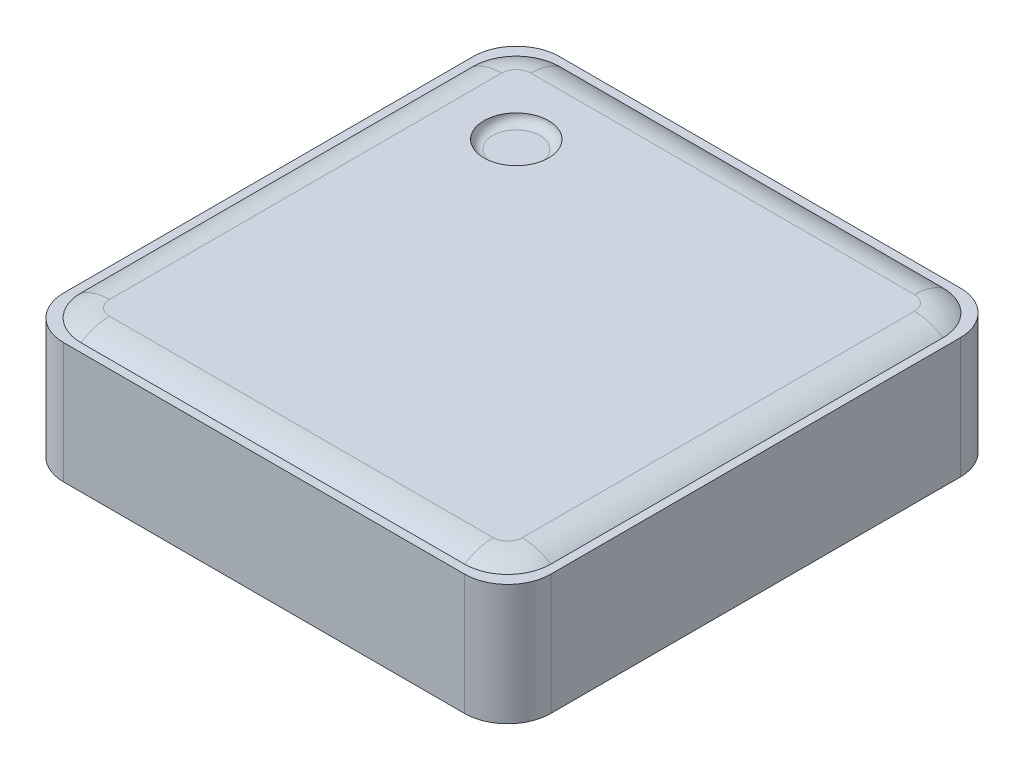
ISO-10303-21;
HEADER;
FILE_DESCRIPTION(('STEP AP214'),'2;1');
FILE_NAME('part.step','',(''),(''),'','','');
FILE_SCHEMA(('AUTOMOTIVE_DESIGN { 1 0 10303 214 1 1 1 1 }'));
ENDSEC;
DATA;
#1=APPLICATION_CONTEXT('core data for automotive mechanical design processes');
#2=APPLICATION_PROTOCOL_DEFINITION('international standard','automotive_design',2000,#1);
#3=PRODUCT_CONTEXT('',#1,'mechanical');
#4=PRODUCT('Part','Part','',(#3));
#5=PRODUCT_RELATED_PRODUCT_CATEGORY('part','',(#4));
#6=PRODUCT_DEFINITION_FORMATION('','',#4);
#7=PRODUCT_DEFINITION_CONTEXT('part definition',#1,'design');
#8=PRODUCT_DEFINITION('design','',#6,#7);
#9=PRODUCT_DEFINITION_SHAPE('','',#8);
#10=(LENGTH_UNIT() NAMED_UNIT(*) SI_UNIT(.MILLI.,.METRE.));
#11=(NAMED_UNIT(*) PLANE_ANGLE_UNIT() SI_UNIT($,.RADIAN.));
#12=(NAMED_UNIT(*) SI_UNIT($,.STERADIAN.) SOLID_ANGLE_UNIT());
#13=UNCERTAINTY_MEASURE_WITH_UNIT(LENGTH_MEASURE(1.E-05),#10,'distance_accuracy_value','');
#14=(GEOMETRIC_REPRESENTATION_CONTEXT(3) GLOBAL_UNCERTAINTY_ASSIGNED_CONTEXT((#13)) GLOBAL_UNIT_ASSIGNED_CONTEXT((#10,
#11,#12)) REPRESENTATION_CONTEXT('',''));
#15=CARTESIAN_POINT('',(0.,0.,0.));
#16=DIRECTION('',(0.,0.,1.));
#17=DIRECTION('',(1.,0.,0.));
#18=AXIS2_PLACEMENT_3D('',#15,#16,#17);
#19=CARTESIAN_POINT('',(-32.8667504192892,30.,-33.8667504192892));
#20=DIRECTION('',(0.,1.,0.));
#21=DIRECTION('',(0.,0.,1.));
#22=AXIS2_PLACEMENT_3D('',#19,#20,#21);
#23=TOROIDAL_SURFACE('',#22,5.5,2.);
#24=CARTESIAN_POINT('',(-32.8667504192892,28.,-33.8667504192892));
#25=DIRECTION('',(0.,1.,0.));
#26=DIRECTION('',(0.,0.,1.));
#27=AXIS2_PLACEMENT_3D('',#24,#25,#26);
#28=CIRCLE('',#27,5.5);
#29=CARTESIAN_POINT('',(-32.8667504192892,28.,-28.3667504192892));
#30=VERTEX_POINT('',#29);
#31=EDGE_CURVE('E11',#30,#30,#28,.T.);
#32=ORIENTED_EDGE('',*,*,#31,.F.);
#33=EDGE_LOOP('',(#32));
#34=FACE_BOUND('',#33,.T.);
#35=CARTESIAN_POINT('',(-32.8667504192892,30.,-33.8667504192892));
#36=DIRECTION('',(0.,1.,0.));
#37=DIRECTION('',(0.,0.,1.));
#38=AXIS2_PLACEMENT_3D('',#35,#36,#37);
#39=CIRCLE('',#38,7.5);
#40=CARTESIAN_POINT('',(-32.8667504192892,30.,-26.3667504192892));
#41=VERTEX_POINT('',#40);
#42=EDGE_CURVE('E208',#41,#41,#39,.T.);
#43=ORIENTED_EDGE('',*,*,#42,.T.);
#44=EDGE_LOOP('',(#43));
#45=FACE_BOUND('',#44,.T.);
#46=ADVANCED_FACE('F35',(#34,#45),#23,.F.);
#47=CARTESIAN_POINT('',(-56.5,30.,-57.5));
#48=DIRECTION('',(1.,0.,0.));
#49=DIRECTION('',(0.,0.,-1.));
#50=AXIS2_PLACEMENT_3D('',#47,#48,#49);
#51=PLANE('',#50);
#52=DIRECTION('',(0.,0.,1.));
#53=VECTOR('',#52,1.);
#54=CARTESIAN_POINT('',(-56.5,0.,-57.5));
#55=LINE('',#54,#53);
#56=CARTESIAN_POINT('',(-56.5,0.,-47.5));
#57=VERTEX_POINT('',#56);
#58=CARTESIAN_POINT('',(-56.5,0.,47.5));
#59=VERTEX_POINT('',#58);
#60=EDGE_CURVE('E249',#57,#59,#55,.T.);
#61=ORIENTED_EDGE('',*,*,#60,.T.);
#62=DIRECTION('',(0.,-1.,0.));
#63=VECTOR('',#62,1.);
#64=CARTESIAN_POINT('',(-56.5,30.,47.5));
#65=LINE('',#64,#63);
#66=CARTESIAN_POINT('',(-56.5,28.,47.5));
#67=VERTEX_POINT('',#66);
#68=EDGE_CURVE('E178',#59,#67,#65,.F.);
#69=ORIENTED_EDGE('',*,*,#68,.T.);
#70=DIRECTION('',(0.,0.,1.));
#71=VECTOR('',#70,1.);
#72=CARTESIAN_POINT('',(-56.5,28.,-57.5));
#73=LINE('',#72,#71);
#74=CARTESIAN_POINT('',(-56.5,28.,-47.5));
#75=VERTEX_POINT('',#74);
#76=EDGE_CURVE('E243',#75,#67,#73,.T.);
#77=ORIENTED_EDGE('',*,*,#76,.F.);
#78=DIRECTION('',(0.,-1.,0.));
#79=VECTOR('',#78,1.);
#80=CARTESIAN_POINT('',(-56.5,30.,-47.5));
#81=LINE('',#80,#79);
#82=EDGE_CURVE('E284',#75,#57,#81,.T.);
#83=ORIENTED_EDGE('',*,*,#82,.T.);
#84=EDGE_LOOP('',(#61,#69,#77,#83));
#85=FACE_BOUND('',#84,.T.);
#86=ADVANCED_FACE('F289',(#85),#51,.F.);
#87=CARTESIAN_POINT('',(56.5,30.,57.5));
#88=DIRECTION('',(0.,0.,-1.));
#89=DIRECTION('',(-1.,0.,0.));
#90=AXIS2_PLACEMENT_3D('',#87,#88,#89);
#91=PLANE('',#90);
#92=DIRECTION('',(1.,0.,0.));
#93=VECTOR('',#92,1.);
#94=CARTESIAN_POINT('',(56.5,0.,57.5));
#95=LINE('',#94,#93);
#96=CARTESIAN_POINT('',(-46.5,0.,57.5));
#97=VERTEX_POINT('',#96);
#98=CARTESIAN_POINT('',(46.5,0.,57.5));
#99=VERTEX_POINT('',#98);
#100=EDGE_CURVE('E252',#97,#99,#95,.T.);
#101=ORIENTED_EDGE('',*,*,#100,.T.);
#102=DIRECTION('',(0.,-1.,0.));
#103=VECTOR('',#102,1.);
#104=CARTESIAN_POINT('',(46.5,30.,57.5));
#105=LINE('',#104,#103);
#106=CARTESIAN_POINT('',(46.5,28.,57.5));
#107=VERTEX_POINT('',#106);
#108=EDGE_CURVE('E277',#99,#107,#105,.F.);
#109=ORIENTED_EDGE('',*,*,#108,.T.);
#110=DIRECTION('',(1.,0.,0.));
#111=VECTOR('',#110,1.);
#112=CARTESIAN_POINT('',(-56.5,28.,57.5));
#113=LINE('',#112,#111);
#114=CARTESIAN_POINT('',(-46.5,28.,57.5));
#115=VERTEX_POINT('',#114);
#116=EDGE_CURVE('E246',#115,#107,#113,.T.);
#117=ORIENTED_EDGE('',*,*,#116,.F.);
#118=DIRECTION('',(0.,-1.,0.));
#119=VECTOR('',#118,1.);
#120=CARTESIAN_POINT('',(-46.5,30.,57.5));
#121=LINE('',#120,#119);
#122=EDGE_CURVE('E274',#115,#97,#121,.T.);
#123=ORIENTED_EDGE('',*,*,#122,.T.);
#124=EDGE_LOOP('',(#101,#109,#117,#123));
#125=FACE_BOUND('',#124,.T.);
#126=ADVANCED_FACE('F300',(#125),#91,.F.);
#127=CARTESIAN_POINT('',(56.5,30.,-57.5));
#128=DIRECTION('',(-1.,0.,0.));
#129=DIRECTION('',(0.,0.,1.));
#130=AXIS2_PLACEMENT_3D('',#127,#128,#129);
#131=PLANE('',#130);
#132=DIRECTION('',(0.,0.,-1.));
#133=VECTOR('',#132,1.);
#134=CARTESIAN_POINT('',(56.5,28.,-57.5));
#135=LINE('',#134,#133);
#136=CARTESIAN_POINT('',(56.5,28.,47.5));
#137=VERTEX_POINT('',#136);
#138=CARTESIAN_POINT('',(56.5,28.,-47.5));
#139=VERTEX_POINT('',#138);
#140=EDGE_CURVE('E231',#137,#139,#135,.T.);
#141=ORIENTED_EDGE('',*,*,#140,.F.);
#142=DIRECTION('',(0.,-1.,0.));
#143=VECTOR('',#142,1.);
#144=CARTESIAN_POINT('',(56.5,30.,47.5));
#145=LINE('',#144,#143);
#146=CARTESIAN_POINT('',(56.5,0.,47.5));
#147=VERTEX_POINT('',#146);
#148=EDGE_CURVE('E263',#137,#147,#145,.T.);
#149=ORIENTED_EDGE('',*,*,#148,.T.);
#150=DIRECTION('',(0.,0.,-1.));
#151=VECTOR('',#150,1.);
#152=CARTESIAN_POINT('',(56.5,0.,-57.5));
#153=LINE('',#152,#151);
#154=CARTESIAN_POINT('',(56.5,0.,-47.5));
#155=VERTEX_POINT('',#154);
#156=EDGE_CURVE('E255',#147,#155,#153,.T.);
#157=ORIENTED_EDGE('',*,*,#156,.T.);
#158=DIRECTION('',(0.,-1.,0.));
#159=VECTOR('',#158,1.);
#160=CARTESIAN_POINT('',(56.5,30.,-47.5));
#161=LINE('',#160,#159);
#162=EDGE_CURVE('E261',#155,#139,#161,.F.);
#163=ORIENTED_EDGE('',*,*,#162,.T.);
#164=EDGE_LOOP('',(#141,#149,#157,#163));
#165=FACE_BOUND('',#164,.T.);
#166=ADVANCED_FACE('F311',(#165),#131,.F.);
#167=CARTESIAN_POINT('',(56.5,30.,-57.5));
#168=DIRECTION('',(0.,0.,1.));
#169=DIRECTION('',(1.,0.,0.));
#170=AXIS2_PLACEMENT_3D('',#167,#168,#169);
#171=PLANE('',#170);
#172=DIRECTION('',(-1.,0.,0.));
#173=VECTOR('',#172,1.);
#174=CARTESIAN_POINT('',(-56.5,28.,-57.5));
#175=LINE('',#174,#173);
#176=CARTESIAN_POINT('',(46.5,28.,-57.5));
#177=VERTEX_POINT('',#176);
#178=CARTESIAN_POINT('',(-46.5,28.,-57.5));
#179=VERTEX_POINT('',#178);
#180=EDGE_CURVE('E235',#177,#179,#175,.T.);
#181=ORIENTED_EDGE('',*,*,#180,.F.);
#182=DIRECTION('',(0.,-1.,0.));
#183=VECTOR('',#182,1.);
#184=CARTESIAN_POINT('',(46.5,30.,-57.5));
#185=LINE('',#184,#183);
#186=CARTESIAN_POINT('',(46.5,0.,-57.5));
#187=VERTEX_POINT('',#186);
#188=EDGE_CURVE('E281',#177,#187,#185,.T.);
#189=ORIENTED_EDGE('',*,*,#188,.T.);
#190=DIRECTION('',(-1.,0.,0.));
#191=VECTOR('',#190,1.);
#192=CARTESIAN_POINT('',(56.5,0.,-57.5));
#193=LINE('',#192,#191);
#194=CARTESIAN_POINT('',(-46.5,0.,-57.5));
#195=VERTEX_POINT('',#194);
#196=EDGE_CURVE('E258',#187,#195,#193,.T.);
#197=ORIENTED_EDGE('',*,*,#196,.T.);
#198=DIRECTION('',(0.,-1.,0.));
#199=VECTOR('',#198,1.);
#200=CARTESIAN_POINT('',(-46.5,30.,-57.5));
#201=LINE('',#200,#199);
#202=EDGE_CURVE('E279',#195,#179,#201,.F.);
#203=ORIENTED_EDGE('',*,*,#202,.T.);
#204=EDGE_LOOP('',(#181,#189,#197,#203));
#205=FACE_BOUND('',#204,.T.);
#206=ADVANCED_FACE('F320',(#205),#171,.F.);
#207=CARTESIAN_POINT('',(0.,0.,0.));
#208=DIRECTION('',(0.,-1.,0.));
#209=DIRECTION('',(0.,0.,-1.));
#210=AXIS2_PLACEMENT_3D('',#207,#208,#209);
#211=PLANE('',#210);
#212=ORIENTED_EDGE('',*,*,#156,.F.);
#213=CARTESIAN_POINT('',(46.5,0.,47.5));
#214=DIRECTION('',(0.,-1.,0.));
#215=DIRECTION('',(0.,0.,-1.));
#216=AXIS2_PLACEMENT_3D('',#213,#214,#215);
#217=CIRCLE('',#216,10.);
#218=EDGE_CURVE('E272',#147,#99,#217,.T.);
#219=ORIENTED_EDGE('',*,*,#218,.T.);
#220=ORIENTED_EDGE('',*,*,#100,.F.);
#221=CARTESIAN_POINT('',(-46.5,0.,47.5));
#222=DIRECTION('',(0.,-1.,0.));
#223=DIRECTION('',(0.,0.,-1.));
#224=AXIS2_PLACEMENT_3D('',#221,#222,#223);
#225=CIRCLE('',#224,10.);
#226=EDGE_CURVE('E268',#97,#59,#225,.T.);
#227=ORIENTED_EDGE('',*,*,#226,.T.);
#228=ORIENTED_EDGE('',*,*,#60,.F.);
#229=CARTESIAN_POINT('',(-46.5,0.,-47.5));
#230=DIRECTION('',(0.,-1.,0.));
#231=DIRECTION('',(0.,0.,-1.));
#232=AXIS2_PLACEMENT_3D('',#229,#230,#231);
#233=CIRCLE('',#232,10.);
#234=EDGE_CURVE('E266',#57,#195,#233,.T.);
#235=ORIENTED_EDGE('',*,*,#234,.T.);
#236=ORIENTED_EDGE('',*,*,#196,.F.);
#237=CARTESIAN_POINT('',(46.5,0.,-47.5));
#238=DIRECTION('',(0.,-1.,0.));
#239=DIRECTION('',(0.,0.,-1.));
#240=AXIS2_PLACEMENT_3D('',#237,#238,#239);
#241=CIRCLE('',#240,10.);
#242=EDGE_CURVE('E270',#187,#155,#241,.T.);
#243=ORIENTED_EDGE('',*,*,#242,.T.);
#244=EDGE_LOOP('',(#212,#219,#220,#227,#228,#235,#236,#243));
#245=FACE_BOUND('',#244,.T.);
#246=ADVANCED_FACE('F304',(#245),#211,.T.);
#247=CARTESIAN_POINT('',(0.,28.,0.));
#248=DIRECTION('',(0.,1.,0.));
#249=DIRECTION('',(0.,0.,1.));
#250=AXIS2_PLACEMENT_3D('',#247,#248,#249);
#251=PLANE('',#250);
#252=DIRECTION('',(1.,0.,0.));
#253=VECTOR('',#252,1.);
#254=CARTESIAN_POINT('',(-54.5,28.,55.5));
#255=LINE('',#254,#253);
#256=CARTESIAN_POINT('',(-44.5,28.,55.5));
#257=VERTEX_POINT('',#256);
#258=CARTESIAN_POINT('',(44.5,28.,55.5));
#259=VERTEX_POINT('',#258);
#260=EDGE_CURVE('E229',#257,#259,#255,.T.);
#261=ORIENTED_EDGE('',*,*,#260,.F.);
#262=CARTESIAN_POINT('',(-44.5,28.,45.5));
#263=DIRECTION('',(0.,1.,0.));
#264=DIRECTION('',(0.,0.,1.));
#265=AXIS2_PLACEMENT_3D('',#262,#263,#264);
#266=CIRCLE('',#265,10.);
#267=CARTESIAN_POINT('',(-54.5,28.,45.5));
#268=VERTEX_POINT('',#267);
#269=EDGE_CURVE('E173',#257,#268,#266,.F.);
#270=ORIENTED_EDGE('',*,*,#269,.T.);
#271=DIRECTION('',(0.,0.,1.));
#272=VECTOR('',#271,1.);
#273=CARTESIAN_POINT('',(-54.5,28.,-55.5));
#274=LINE('',#273,#272);
#275=CARTESIAN_POINT('',(-54.5,28.,-45.5));
#276=VERTEX_POINT('',#275);
#277=EDGE_CURVE('E232',#276,#268,#274,.T.);
#278=ORIENTED_EDGE('',*,*,#277,.F.);
#279=CARTESIAN_POINT('',(-44.5,28.,-45.5));
#280=DIRECTION('',(0.,1.,0.));
#281=DIRECTION('',(0.,0.,1.));
#282=AXIS2_PLACEMENT_3D('',#279,#280,#281);
#283=CIRCLE('',#282,10.);
#284=CARTESIAN_POINT('',(-44.5,28.,-55.5));
#285=VERTEX_POINT('',#284);
#286=EDGE_CURVE('E176',#276,#285,#283,.F.);
#287=ORIENTED_EDGE('',*,*,#286,.T.);
#288=DIRECTION('',(-1.,0.,0.));
#289=VECTOR('',#288,1.);
#290=CARTESIAN_POINT('',(-54.5,28.,-55.5));
#291=LINE('',#290,#289);
#292=CARTESIAN_POINT('',(44.5,28.,-55.5));
#293=VERTEX_POINT('',#292);
#294=EDGE_CURVE('E156',#293,#285,#291,.T.);
#295=ORIENTED_EDGE('',*,*,#294,.F.);
#296=CARTESIAN_POINT('',(44.5,28.,-45.5));
#297=DIRECTION('',(0.,1.,0.));
#298=DIRECTION('',(0.,0.,1.));
#299=AXIS2_PLACEMENT_3D('',#296,#297,#298);
#300=CIRCLE('',#299,10.);
#301=CARTESIAN_POINT('',(54.5,28.,-45.5));
#302=VERTEX_POINT('',#301);
#303=EDGE_CURVE('E152',#293,#302,#300,.F.);
#304=ORIENTED_EDGE('',*,*,#303,.T.);
#305=DIRECTION('',(0.,0.,-1.));
#306=VECTOR('',#305,1.);
#307=CARTESIAN_POINT('',(54.5,28.,-55.5));
#308=LINE('',#307,#306);
#309=CARTESIAN_POINT('',(54.5,28.,45.5));
#310=VERTEX_POINT('',#309);
#311=EDGE_CURVE('E144',#310,#302,#308,.T.);
#312=ORIENTED_EDGE('',*,*,#311,.F.);
#313=CARTESIAN_POINT('',(44.5,28.,45.5));
#314=DIRECTION('',(0.,1.,0.));
#315=DIRECTION('',(0.,0.,1.));
#316=AXIS2_PLACEMENT_3D('',#313,#314,#315);
#317=CIRCLE('',#316,10.);
#318=EDGE_CURVE('E149',#310,#259,#317,.F.);
#319=ORIENTED_EDGE('',*,*,#318,.T.);
#320=EDGE_LOOP('',(#261,#270,#278,#287,#295,#304,#312,#319));
#321=FACE_BOUND('',#320,.T.);
#322=ORIENTED_EDGE('',*,*,#116,.T.);
#323=CARTESIAN_POINT('',(46.5,28.,47.5));
#324=DIRECTION('',(0.,1.,0.));
#325=DIRECTION('',(0.,0.,1.));
#326=AXIS2_PLACEMENT_3D('',#323,#324,#325);
#327=CIRCLE('',#326,10.);
#328=EDGE_CURVE('E189',#107,#137,#327,.T.);
#329=ORIENTED_EDGE('',*,*,#328,.T.);
#330=ORIENTED_EDGE('',*,*,#140,.T.);
#331=CARTESIAN_POINT('',(46.5,28.,-47.5));
#332=DIRECTION('',(0.,1.,0.));
#333=DIRECTION('',(0.,0.,1.));
#334=AXIS2_PLACEMENT_3D('',#331,#332,#333);
#335=CIRCLE('',#334,10.);
#336=EDGE_CURVE('E187',#139,#177,#335,.T.);
#337=ORIENTED_EDGE('',*,*,#336,.T.);
#338=ORIENTED_EDGE('',*,*,#180,.T.);
#339=CARTESIAN_POINT('',(-46.5,28.,-47.5));
#340=DIRECTION('',(0.,1.,0.));
#341=DIRECTION('',(0.,0.,1.));
#342=AXIS2_PLACEMENT_3D('',#339,#340,#341);
#343=CIRCLE('',#342,10.);
#344=EDGE_CURVE('E183',#179,#75,#343,.T.);
#345=ORIENTED_EDGE('',*,*,#344,.T.);
#346=ORIENTED_EDGE('',*,*,#76,.T.);
#347=CARTESIAN_POINT('',(-46.5,28.,47.5));
#348=DIRECTION('',(0.,1.,0.));
#349=DIRECTION('',(0.,0.,1.));
#350=AXIS2_PLACEMENT_3D('',#347,#348,#349);
#351=CIRCLE('',#350,10.);
#352=EDGE_CURVE('E185',#67,#115,#351,.T.);
#353=ORIENTED_EDGE('',*,*,#352,.T.);
#354=EDGE_LOOP('',(#322,#329,#330,#337,#338,#345,#346,#353));
#355=FACE_BOUND('',#354,.T.);
#356=ADVANCED_FACE('F146',(#321,#355),#251,.T.);
#357=CARTESIAN_POINT('',(0.,30.,0.));
#358=DIRECTION('',(0.,-1.,0.));
#359=DIRECTION('',(0.,0.,-1.));
#360=AXIS2_PLACEMENT_3D('',#357,#358,#359);
#361=PLANE('',#360);
#362=ORIENTED_EDGE('',*,*,#42,.F.);
#363=EDGE_LOOP('',(#362));
#364=FACE_BOUND('',#363,.T.);
#365=DIRECTION('',(1.,0.,0.));
#366=VECTOR('',#365,1.);
#367=CARTESIAN_POINT('',(0.,30.,-48.8667504192892));
#368=LINE('',#367,#366);
#369=CARTESIAN_POINT('',(44.5,30.,-48.8667504192892));
#370=VERTEX_POINT('',#369);
#371=CARTESIAN_POINT('',(-44.5,30.,-48.8667504192892));
#372=VERTEX_POINT('',#371);
#373=EDGE_CURVE('E53',#370,#372,#368,.F.);
#374=ORIENTED_EDGE('',*,*,#373,.T.);
#375=CARTESIAN_POINT('',(-44.5,30.,-45.5));
#376=DIRECTION('',(0.,-1.,0.));
#377=DIRECTION('',(0.,0.,-1.));
#378=AXIS2_PLACEMENT_3D('',#375,#376,#377);
#379=CIRCLE('',#378,3.3667504192892);
#380=CARTESIAN_POINT('',(-47.8667504192892,30.,-45.5));
#381=VERTEX_POINT('',#380);
#382=EDGE_CURVE('E42',#372,#381,#379,.F.);
#383=ORIENTED_EDGE('',*,*,#382,.T.);
#384=DIRECTION('',(0.,0.,-1.));
#385=VECTOR('',#384,1.);
#386=CARTESIAN_POINT('',(-47.8667504192892,30.,0.));
#387=LINE('',#386,#385);
#388=CARTESIAN_POINT('',(-47.8667504192892,30.,45.5));
#389=VERTEX_POINT('',#388);
#390=EDGE_CURVE('E202',#381,#389,#387,.F.);
#391=ORIENTED_EDGE('',*,*,#390,.T.);
#392=CARTESIAN_POINT('',(-44.5,30.,45.5));
#393=DIRECTION('',(0.,-1.,0.));
#394=DIRECTION('',(0.,0.,-1.));
#395=AXIS2_PLACEMENT_3D('',#392,#393,#394);
#396=CIRCLE('',#395,3.3667504192892);
#397=CARTESIAN_POINT('',(-44.5,30.,48.8667504192892));
#398=VERTEX_POINT('',#397);
#399=EDGE_CURVE('E198',#389,#398,#396,.F.);
#400=ORIENTED_EDGE('',*,*,#399,.T.);
#401=DIRECTION('',(-1.,0.,0.));
#402=VECTOR('',#401,1.);
#403=CARTESIAN_POINT('',(0.,30.,48.8667504192892));
#404=LINE('',#403,#402);
#405=CARTESIAN_POINT('',(44.5,30.,48.8667504192892));
#406=VERTEX_POINT('',#405);
#407=EDGE_CURVE('E196',#398,#406,#404,.F.);
#408=ORIENTED_EDGE('',*,*,#407,.T.);
#409=CARTESIAN_POINT('',(44.5,30.,45.5));
#410=DIRECTION('',(0.,-1.,0.));
#411=DIRECTION('',(0.,0.,-1.));
#412=AXIS2_PLACEMENT_3D('',#409,#410,#411);
#413=CIRCLE('',#412,3.3667504192892);
#414=CARTESIAN_POINT('',(47.8667504192892,30.,45.5));
#415=VERTEX_POINT('',#414);
#416=EDGE_CURVE('E192',#406,#415,#413,.F.);
#417=ORIENTED_EDGE('',*,*,#416,.T.);
#418=DIRECTION('',(0.,0.,1.));
#419=VECTOR('',#418,1.);
#420=CARTESIAN_POINT('',(47.8667504192892,30.,0.));
#421=LINE('',#420,#419);
#422=CARTESIAN_POINT('',(47.8667504192892,30.,-45.5));
#423=VERTEX_POINT('',#422);
#424=EDGE_CURVE('E163',#415,#423,#421,.F.);
#425=ORIENTED_EDGE('',*,*,#424,.T.);
#426=CARTESIAN_POINT('',(44.5,30.,-45.5));
#427=DIRECTION('',(0.,-1.,0.));
#428=DIRECTION('',(0.,0.,-1.));
#429=AXIS2_PLACEMENT_3D('',#426,#427,#428);
#430=CIRCLE('',#429,3.3667504192892);
#431=EDGE_CURVE('E194',#423,#370,#430,.F.);
#432=ORIENTED_EDGE('',*,*,#431,.T.);
#433=EDGE_LOOP('',(#374,#383,#391,#400,#408,#417,#425,#432));
#434=FACE_BOUND('',#433,.T.);
#435=ADVANCED_FACE('F224',(#364,#434),#361,.F.);
#436=CARTESIAN_POINT('',(46.5,30.,47.5));
#437=DIRECTION('',(0.,-1.,0.));
#438=DIRECTION('',(0.,0.,-1.));
#439=AXIS2_PLACEMENT_3D('',#436,#437,#438);
#440=CYLINDRICAL_SURFACE('',#439,10.);
#441=ORIENTED_EDGE('',*,*,#328,.F.);
#442=ORIENTED_EDGE('',*,*,#108,.F.);
#443=ORIENTED_EDGE('',*,*,#218,.F.);
#444=ORIENTED_EDGE('',*,*,#148,.F.);
#445=EDGE_LOOP('',(#441,#442,#443,#444));
#446=FACE_BOUND('',#445,.T.);
#447=ADVANCED_FACE('F308',(#446),#440,.T.);
#448=CARTESIAN_POINT('',(46.5,30.,-47.5));
#449=DIRECTION('',(0.,-1.,0.));
#450=DIRECTION('',(0.,0.,-1.));
#451=AXIS2_PLACEMENT_3D('',#448,#449,#450);
#452=CYLINDRICAL_SURFACE('',#451,10.);
#453=ORIENTED_EDGE('',*,*,#336,.F.);
#454=ORIENTED_EDGE('',*,*,#162,.F.);
#455=ORIENTED_EDGE('',*,*,#242,.F.);
#456=ORIENTED_EDGE('',*,*,#188,.F.);
#457=EDGE_LOOP('',(#453,#454,#455,#456));
#458=FACE_BOUND('',#457,.T.);
#459=ADVANCED_FACE('F317',(#458),#452,.T.);
#460=CARTESIAN_POINT('',(-46.5,30.,47.5));
#461=DIRECTION('',(0.,-1.,0.));
#462=DIRECTION('',(0.,0.,-1.));
#463=AXIS2_PLACEMENT_3D('',#460,#461,#462);
#464=CYLINDRICAL_SURFACE('',#463,10.);
#465=ORIENTED_EDGE('',*,*,#352,.F.);
#466=ORIENTED_EDGE('',*,*,#68,.F.);
#467=ORIENTED_EDGE('',*,*,#226,.F.);
#468=ORIENTED_EDGE('',*,*,#122,.F.);
#469=EDGE_LOOP('',(#465,#466,#467,#468));
#470=FACE_BOUND('',#469,.T.);
#471=ADVANCED_FACE('F297',(#470),#464,.T.);
#472=CARTESIAN_POINT('',(-46.5,30.,-47.5));
#473=DIRECTION('',(0.,-1.,0.));
#474=DIRECTION('',(0.,0.,-1.));
#475=AXIS2_PLACEMENT_3D('',#472,#473,#474);
#476=CYLINDRICAL_SURFACE('',#475,10.);
#477=ORIENTED_EDGE('',*,*,#344,.F.);
#478=ORIENTED_EDGE('',*,*,#202,.F.);
#479=ORIENTED_EDGE('',*,*,#234,.F.);
#480=ORIENTED_EDGE('',*,*,#82,.F.);
#481=EDGE_LOOP('',(#477,#478,#479,#480));
#482=FACE_BOUND('',#481,.T.);
#483=ADVANCED_FACE('F323',(#482),#476,.T.);
#484=CARTESIAN_POINT('',(44.5,18.,-45.5));
#485=DIRECTION('',(0.,1.,0.));
#486=DIRECTION('',(0.,0.,1.));
#487=AXIS2_PLACEMENT_3D('',#484,#485,#486);
#488=DEGENERATE_TOROIDAL_SURFACE('',#487,3.3667504192892,12.,.T.);
#489=CARTESIAN_POINT('',(47.8667504192892,18.,-45.5));
#490=DIRECTION('',(0.,0.,1.));
#491=DIRECTION('',(1.,0.,0.));
#492=AXIS2_PLACEMENT_3D('',#489,#490,#491);
#493=CIRCLE('',#492,12.);
#494=EDGE_CURVE('E215',#302,#423,#493,.T.);
#495=ORIENTED_EDGE('',*,*,#494,.F.);
#496=ORIENTED_EDGE('',*,*,#303,.F.);
#497=CARTESIAN_POINT('',(44.5,18.,-48.8667504192892));
#498=DIRECTION('',(-1.,0.,0.));
#499=DIRECTION('',(0.,0.,1.));
#500=AXIS2_PLACEMENT_3D('',#497,#498,#499);
#501=CIRCLE('',#500,12.);
#502=EDGE_CURVE('E157',#370,#293,#501,.T.);
#503=ORIENTED_EDGE('',*,*,#502,.F.);
#504=ORIENTED_EDGE('',*,*,#431,.F.);
#505=EDGE_LOOP('',(#495,#496,#503,#504));
#506=FACE_BOUND('',#505,.T.);
#507=ADVANCED_FACE('F223',(#506),#488,.T.);
#508=CARTESIAN_POINT('',(-54.5,18.,-48.8667504192892));
#509=DIRECTION('',(1.,0.,0.));
#510=DIRECTION('',(0.,0.,-1.));
#511=AXIS2_PLACEMENT_3D('',#508,#509,#510);
#512=CYLINDRICAL_SURFACE('',#511,12.);
#513=ORIENTED_EDGE('',*,*,#502,.T.);
#514=ORIENTED_EDGE('',*,*,#294,.T.);
#515=CARTESIAN_POINT('',(-44.5,18.,-48.8667504192892));
#516=DIRECTION('',(-1.,0.,0.));
#517=DIRECTION('',(0.,0.,1.));
#518=AXIS2_PLACEMENT_3D('',#515,#516,#517);
#519=CIRCLE('',#518,12.);
#520=EDGE_CURVE('E166',#372,#285,#519,.T.);
#521=ORIENTED_EDGE('',*,*,#520,.F.);
#522=ORIENTED_EDGE('',*,*,#373,.F.);
#523=EDGE_LOOP('',(#513,#514,#521,#522));
#524=FACE_BOUND('',#523,.T.);
#525=ADVANCED_FACE('F220',(#524),#512,.T.);
#526=CARTESIAN_POINT('',(47.8667504192892,18.,-55.5));
#527=DIRECTION('',(0.,0.,1.));
#528=DIRECTION('',(1.,0.,0.));
#529=AXIS2_PLACEMENT_3D('',#526,#527,#528);
#530=CYLINDRICAL_SURFACE('',#529,12.);
#531=ORIENTED_EDGE('',*,*,#494,.T.);
#532=ORIENTED_EDGE('',*,*,#424,.F.);
#533=CARTESIAN_POINT('',(47.8667504192892,18.,45.5));
#534=DIRECTION('',(0.,0.,1.));
#535=DIRECTION('',(1.,0.,0.));
#536=AXIS2_PLACEMENT_3D('',#533,#534,#535);
#537=CIRCLE('',#536,12.);
#538=EDGE_CURVE('E161',#310,#415,#537,.T.);
#539=ORIENTED_EDGE('',*,*,#538,.F.);
#540=ORIENTED_EDGE('',*,*,#311,.T.);
#541=EDGE_LOOP('',(#531,#532,#539,#540));
#542=FACE_BOUND('',#541,.T.);
#543=ADVANCED_FACE('F162',(#542),#530,.T.);
#544=CARTESIAN_POINT('',(-44.5,18.,-45.5));
#545=DIRECTION('',(0.,1.,0.));
#546=DIRECTION('',(0.,0.,1.));
#547=AXIS2_PLACEMENT_3D('',#544,#545,#546);
#548=DEGENERATE_TOROIDAL_SURFACE('',#547,3.3667504192892,12.,.T.);
#549=ORIENTED_EDGE('',*,*,#520,.T.);
#550=ORIENTED_EDGE('',*,*,#286,.F.);
#551=CARTESIAN_POINT('',(-47.8667504192892,18.,-45.5));
#552=DIRECTION('',(0.,0.,1.));
#553=DIRECTION('',(1.,0.,0.));
#554=AXIS2_PLACEMENT_3D('',#551,#552,#553);
#555=CIRCLE('',#554,12.);
#556=EDGE_CURVE('E167',#381,#276,#555,.T.);
#557=ORIENTED_EDGE('',*,*,#556,.F.);
#558=ORIENTED_EDGE('',*,*,#382,.F.);
#559=EDGE_LOOP('',(#549,#550,#557,#558));
#560=FACE_BOUND('',#559,.T.);
#561=ADVANCED_FACE('F460',(#560),#548,.T.);
#562=CARTESIAN_POINT('',(44.5,18.,45.5));
#563=DIRECTION('',(0.,1.,0.));
#564=DIRECTION('',(0.,0.,1.));
#565=AXIS2_PLACEMENT_3D('',#562,#563,#564);
#566=DEGENERATE_TOROIDAL_SURFACE('',#565,3.3667504192892,12.,.T.);
#567=ORIENTED_EDGE('',*,*,#538,.T.);
#568=ORIENTED_EDGE('',*,*,#416,.F.);
#569=CARTESIAN_POINT('',(44.5,18.,48.8667504192892));
#570=DIRECTION('',(-1.,0.,0.));
#571=DIRECTION('',(0.,0.,1.));
#572=AXIS2_PLACEMENT_3D('',#569,#570,#571);
#573=CIRCLE('',#572,12.);
#574=EDGE_CURVE('E171',#259,#406,#573,.T.);
#575=ORIENTED_EDGE('',*,*,#574,.F.);
#576=ORIENTED_EDGE('',*,*,#318,.F.);
#577=EDGE_LOOP('',(#567,#568,#575,#576));
#578=FACE_BOUND('',#577,.T.);
#579=ADVANCED_FACE('F169',(#578),#566,.T.);
#580=CARTESIAN_POINT('',(-47.8667504192892,18.,-55.5));
#581=DIRECTION('',(0.,0.,-1.));
#582=DIRECTION('',(-1.,0.,0.));
#583=AXIS2_PLACEMENT_3D('',#580,#581,#582);
#584=CYLINDRICAL_SURFACE('',#583,12.);
#585=ORIENTED_EDGE('',*,*,#556,.T.);
#586=ORIENTED_EDGE('',*,*,#277,.T.);
#587=CARTESIAN_POINT('',(-47.8667504192892,18.,45.5));
#588=DIRECTION('',(0.,0.,1.));
#589=DIRECTION('',(1.,0.,0.));
#590=AXIS2_PLACEMENT_3D('',#587,#588,#589);
#591=CIRCLE('',#590,12.);
#592=EDGE_CURVE('E207',#389,#268,#591,.T.);
#593=ORIENTED_EDGE('',*,*,#592,.F.);
#594=ORIENTED_EDGE('',*,*,#390,.F.);
#595=EDGE_LOOP('',(#585,#586,#593,#594));
#596=FACE_BOUND('',#595,.T.);
#597=ADVANCED_FACE('F442',(#596),#584,.T.);
#598=CARTESIAN_POINT('',(-54.5,18.,48.8667504192892));
#599=DIRECTION('',(-1.,0.,0.));
#600=DIRECTION('',(0.,0.,1.));
#601=AXIS2_PLACEMENT_3D('',#598,#599,#600);
#602=CYLINDRICAL_SURFACE('',#601,12.);
#603=ORIENTED_EDGE('',*,*,#574,.T.);
#604=ORIENTED_EDGE('',*,*,#407,.F.);
#605=CARTESIAN_POINT('',(-44.5,18.,48.8667504192892));
#606=DIRECTION('',(-1.,0.,0.));
#607=DIRECTION('',(0.,0.,1.));
#608=AXIS2_PLACEMENT_3D('',#605,#606,#607);
#609=CIRCLE('',#608,12.);
#610=EDGE_CURVE('E205',#257,#398,#609,.T.);
#611=ORIENTED_EDGE('',*,*,#610,.F.);
#612=ORIENTED_EDGE('',*,*,#260,.T.);
#613=EDGE_LOOP('',(#603,#604,#611,#612));
#614=FACE_BOUND('',#613,.T.);
#615=ADVANCED_FACE('F227',(#614),#602,.T.);
#616=CARTESIAN_POINT('',(-44.5,18.,45.5));
#617=DIRECTION('',(0.,1.,0.));
#618=DIRECTION('',(0.,0.,1.));
#619=AXIS2_PLACEMENT_3D('',#616,#617,#618);
#620=DEGENERATE_TOROIDAL_SURFACE('',#619,3.3667504192892,12.,.T.);
#621=ORIENTED_EDGE('',*,*,#592,.T.);
#622=ORIENTED_EDGE('',*,*,#269,.F.);
#623=ORIENTED_EDGE('',*,*,#610,.T.);
#624=ORIENTED_EDGE('',*,*,#399,.F.);
#625=EDGE_LOOP('',(#621,#622,#623,#624));
#626=FACE_BOUND('',#625,.T.);
#627=ADVANCED_FACE('F421',(#626),#620,.T.);
#628=CARTESIAN_POINT('',(-32.8667504192892,28.,-33.8667504192892));
#629=DIRECTION('',(0.,1.,0.));
#630=DIRECTION('',(0.,0.,1.));
#631=AXIS2_PLACEMENT_3D('',#628,#629,#630);
#632=PLANE('',#631);
#633=ORIENTED_EDGE('',*,*,#31,.T.);
#634=EDGE_LOOP('',(#633));
#635=FACE_BOUND('',#634,.T.);
#636=ADVANCED_FACE('F419',(#635),#632,.T.);
#637=CLOSED_SHELL('',(#46,#86,#126,#166,#206,#246,#356,#435,#447,#459,#471,#483,#507,#525,#543,
#561,#579,#597,#615,#627,#636));
#638=MANIFOLD_SOLID_BREP('B2',#637);
#639=ADVANCED_BREP_SHAPE_REPRESENTATION('',(#18,#638),#14);
#640=SHAPE_DEFINITION_REPRESENTATION(#9,#639);
ENDSEC;
END-ISO-10303-21;
